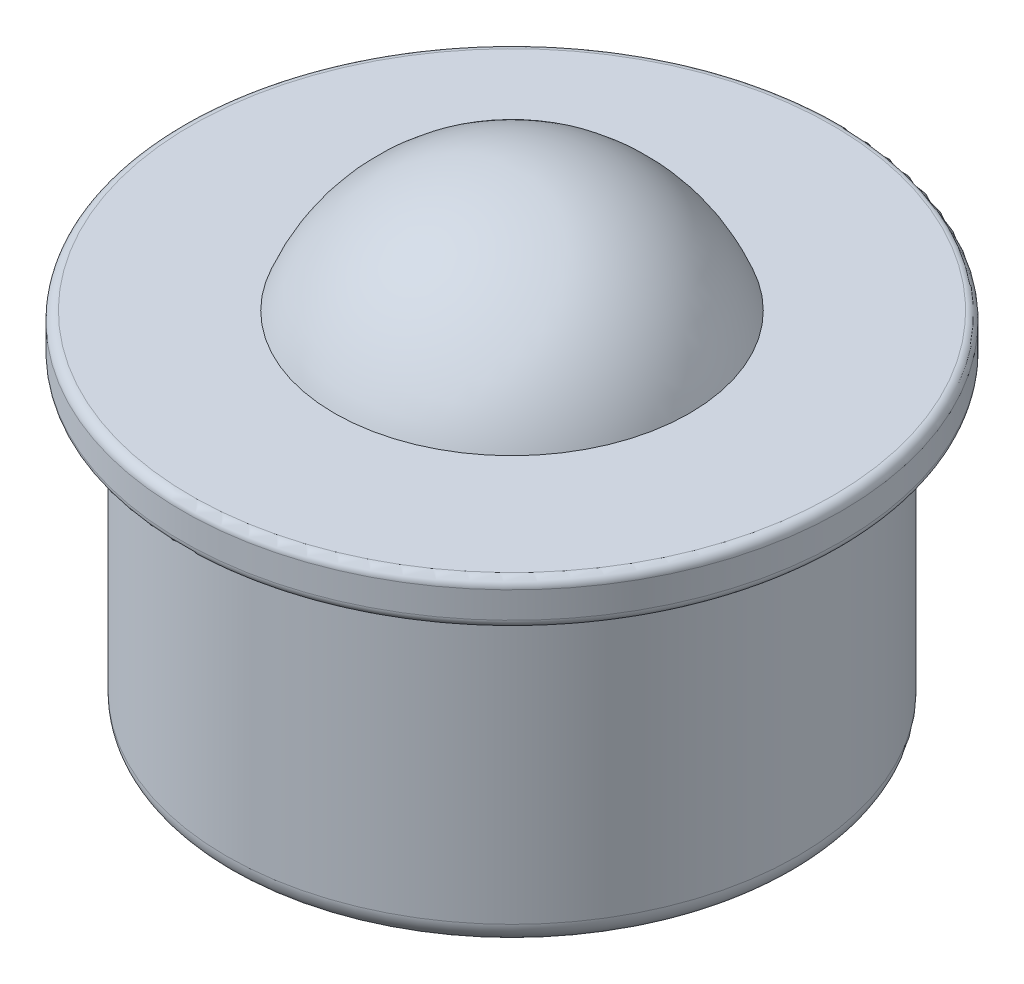
ISO-10303-21;
HEADER;
FILE_DESCRIPTION(('STEP AP214'),'2;1');
FILE_NAME('part.step','',(''),(''),'','','');
FILE_SCHEMA(('AUTOMOTIVE_DESIGN { 1 0 10303 214 1 1 1 1 }'));
ENDSEC;
DATA;
#1=APPLICATION_CONTEXT('core data for automotive mechanical design processes');
#2=APPLICATION_PROTOCOL_DEFINITION('international standard','automotive_design',2000,#1);
#3=PRODUCT_CONTEXT('',#1,'mechanical');
#4=PRODUCT('Part','Part','',(#3));
#5=PRODUCT_RELATED_PRODUCT_CATEGORY('part','',(#4));
#6=PRODUCT_DEFINITION_FORMATION('','',#4);
#7=PRODUCT_DEFINITION_CONTEXT('part definition',#1,'design');
#8=PRODUCT_DEFINITION('design','',#6,#7);
#9=PRODUCT_DEFINITION_SHAPE('','',#8);
#10=(LENGTH_UNIT() NAMED_UNIT(*) SI_UNIT(.MILLI.,.METRE.));
#11=(NAMED_UNIT(*) PLANE_ANGLE_UNIT() SI_UNIT($,.RADIAN.));
#12=(NAMED_UNIT(*) SI_UNIT($,.STERADIAN.) SOLID_ANGLE_UNIT());
#13=UNCERTAINTY_MEASURE_WITH_UNIT(LENGTH_MEASURE(1.E-05),#10,'distance_accuracy_value','');
#14=(GEOMETRIC_REPRESENTATION_CONTEXT(3) GLOBAL_UNCERTAINTY_ASSIGNED_CONTEXT((#13)) GLOBAL_UNIT_ASSIGNED_CONTEXT((#10,
#11,#12)) REPRESENTATION_CONTEXT('',''));
#15=CARTESIAN_POINT('',(0.,0.,0.));
#16=DIRECTION('',(0.,0.,1.));
#17=DIRECTION('',(1.,0.,0.));
#18=AXIS2_PLACEMENT_3D('',#15,#16,#17);
#19=CARTESIAN_POINT('',(0.,0.,0.));
#20=DIRECTION('',(0.,1.,0.));
#21=DIRECTION('',(-1.,0.,0.));
#22=AXIS2_PLACEMENT_3D('',#19,#20,#21);
#23=PLANE('',#22);
#24=CARTESIAN_POINT('',(0.,0.,0.));
#25=DIRECTION('',(0.,1.,0.));
#26=DIRECTION('',(-1.,0.,0.));
#27=AXIS2_PLACEMENT_3D('',#24,#25,#26);
#28=CIRCLE('',#27,6.);
#29=CARTESIAN_POINT('',(-6.,0.,0.));
#30=VERTEX_POINT('',#29);
#31=EDGE_CURVE('E53',#30,#30,#28,.F.);
#32=ORIENTED_EDGE('',*,*,#31,.T.);
#33=EDGE_LOOP('',(#32));
#34=FACE_BOUND('',#33,.T.);
#35=ADVANCED_FACE('F33',(#34),#23,.F.);
#36=CARTESIAN_POINT('',(0.,28.4040034859657,0.));
#37=DIRECTION('',(0.,1.,0.));
#38=DIRECTION('',(-1.,0.,0.));
#39=AXIS2_PLACEMENT_3D('',#36,#37,#38);
#40=CYLINDRICAL_SURFACE('',#39,6.5);
#41=CARTESIAN_POINT('',(0.,0.5,0.));
#42=DIRECTION('',(0.,1.,0.));
#43=DIRECTION('',(-1.,0.,0.));
#44=AXIS2_PLACEMENT_3D('',#41,#42,#43);
#45=CIRCLE('',#44,6.5);
#46=CARTESIAN_POINT('',(-6.5,0.5,0.));
#47=VERTEX_POINT('',#46);
#48=EDGE_CURVE('E56',#47,#47,#45,.T.);
#49=ORIENTED_EDGE('',*,*,#48,.T.);
#50=EDGE_LOOP('',(#49));
#51=FACE_BOUND('',#50,.T.);
#52=CARTESIAN_POINT('',(0.,7.,0.));
#53=DIRECTION('',(0.,1.,0.));
#54=DIRECTION('',(-1.,0.,0.));
#55=AXIS2_PLACEMENT_3D('',#52,#53,#54);
#56=CIRCLE('',#55,6.5);
#57=CARTESIAN_POINT('',(-6.5,7.,0.));
#58=VERTEX_POINT('',#57);
#59=EDGE_CURVE('E59',#58,#58,#56,.T.);
#60=ORIENTED_EDGE('',*,*,#59,.F.);
#61=EDGE_LOOP('',(#60));
#62=FACE_BOUND('',#61,.T.);
#63=ADVANCED_FACE('F82',(#51,#62),#40,.T.);
#64=CARTESIAN_POINT('',(6.5,7.,0.));
#65=DIRECTION('',(0.,1.,0.));
#66=DIRECTION('',(-1.,0.,0.));
#67=AXIS2_PLACEMENT_3D('',#64,#65,#66);
#68=PLANE('',#67);
#69=CARTESIAN_POINT('',(0.,7.,0.));
#70=DIRECTION('',(0.,1.,0.));
#71=DIRECTION('',(-1.,0.,0.));
#72=AXIS2_PLACEMENT_3D('',#69,#70,#71);
#73=CIRCLE('',#72,7.3);
#74=CARTESIAN_POINT('',(-7.3,7.,0.));
#75=VERTEX_POINT('',#74);
#76=EDGE_CURVE('E40',#75,#75,#73,.F.);
#77=ORIENTED_EDGE('',*,*,#76,.T.);
#78=EDGE_LOOP('',(#77));
#79=FACE_BOUND('',#78,.T.);
#80=ORIENTED_EDGE('',*,*,#59,.T.);
#81=EDGE_LOOP('',(#80));
#82=FACE_BOUND('',#81,.T.);
#83=ADVANCED_FACE('F78',(#79,#82),#68,.F.);
#84=CARTESIAN_POINT('',(0.,28.4040034859657,0.));
#85=DIRECTION('',(0.,1.,0.));
#86=DIRECTION('',(-1.,0.,0.));
#87=AXIS2_PLACEMENT_3D('',#84,#85,#86);
#88=CYLINDRICAL_SURFACE('',#87,7.5);
#89=CARTESIAN_POINT('',(0.,7.2,0.));
#90=DIRECTION('',(0.,1.,0.));
#91=DIRECTION('',(-1.,0.,0.));
#92=AXIS2_PLACEMENT_3D('',#89,#90,#91);
#93=CIRCLE('',#92,7.5);
#94=CARTESIAN_POINT('',(-7.5,7.2,0.));
#95=VERTEX_POINT('',#94);
#96=EDGE_CURVE('E44',#95,#95,#93,.T.);
#97=ORIENTED_EDGE('',*,*,#96,.T.);
#98=EDGE_LOOP('',(#97));
#99=FACE_BOUND('',#98,.T.);
#100=CARTESIAN_POINT('',(0.,7.8,0.));
#101=DIRECTION('',(0.,-1.,0.));
#102=DIRECTION('',(1.,0.,0.));
#103=AXIS2_PLACEMENT_3D('',#100,#101,#102);
#104=CIRCLE('',#103,7.5);
#105=CARTESIAN_POINT('',(7.50000000000001,7.8,0.));
#106=VERTEX_POINT('',#105);
#107=EDGE_CURVE('E48',#106,#106,#104,.T.);
#108=ORIENTED_EDGE('',*,*,#107,.T.);
#109=EDGE_LOOP('',(#108));
#110=FACE_BOUND('',#109,.T.);
#111=ADVANCED_FACE('F70',(#99,#110),#88,.T.);
#112=CARTESIAN_POINT('',(4.04376062595204,8.,0.));
#113=DIRECTION('',(0.,-1.,0.));
#114=DIRECTION('',(1.,0.,0.));
#115=AXIS2_PLACEMENT_3D('',#112,#113,#114);
#116=PLANE('',#115);
#117=CARTESIAN_POINT('',(0.,8.,0.));
#118=DIRECTION('',(0.,-1.,0.));
#119=DIRECTION('',(1.,0.,0.));
#120=AXIS2_PLACEMENT_3D('',#117,#118,#119);
#121=CIRCLE('',#120,7.3);
#122=CARTESIAN_POINT('',(7.30000000000001,8.,0.));
#123=VERTEX_POINT('',#122);
#124=EDGE_CURVE('E10',#123,#123,#121,.F.);
#125=ORIENTED_EDGE('',*,*,#124,.T.);
#126=EDGE_LOOP('',(#125));
#127=FACE_BOUND('',#126,.T.);
#128=CARTESIAN_POINT('',(0.,8.,0.));
#129=DIRECTION('',(0.,1.,0.));
#130=DIRECTION('',(-1.,0.,0.));
#131=AXIS2_PLACEMENT_3D('',#128,#129,#130);
#132=CIRCLE('',#131,4.04376062595204);
#133=CARTESIAN_POINT('',(-4.04376062595203,8.,0.));
#134=VERTEX_POINT('',#133);
#135=EDGE_CURVE('E62',#134,#134,#132,.T.);
#136=ORIENTED_EDGE('',*,*,#135,.F.);
#137=EDGE_LOOP('',(#136));
#138=FACE_BOUND('',#137,.T.);
#139=ADVANCED_FACE('F68',(#127,#138),#116,.F.);
#140=CARTESIAN_POINT('',(0.,6.48,0.));
#141=DIRECTION('',(0.,1.,0.));
#142=DIRECTION('',(1.,0.,0.));
#143=AXIS2_PLACEMENT_3D('',#140,#141,#142);
#144=SPHERICAL_SURFACE('',#143,4.32);
#145=ORIENTED_EDGE('',*,*,#135,.T.);
#146=EDGE_LOOP('',(#145));
#147=FACE_BOUND('',#146,.T.);
#148=ADVANCED_FACE('F66',(#147),#144,.T.);
#149=CARTESIAN_POINT('',(0.,0.5,0.));
#150=DIRECTION('',(0.,1.,0.));
#151=DIRECTION('',(-1.,0.,0.));
#152=AXIS2_PLACEMENT_3D('',#149,#150,#151);
#153=TOROIDAL_SURFACE('',#152,6.,0.5);
#154=ORIENTED_EDGE('',*,*,#31,.F.);
#155=EDGE_LOOP('',(#154));
#156=FACE_BOUND('',#155,.T.);
#157=ORIENTED_EDGE('',*,*,#48,.F.);
#158=EDGE_LOOP('',(#157));
#159=FACE_BOUND('',#158,.T.);
#160=ADVANCED_FACE('F76',(#156,#159),#153,.T.);
#161=CARTESIAN_POINT('',(0.,7.2,0.));
#162=DIRECTION('',(0.,1.,0.));
#163=DIRECTION('',(-1.,0.,0.));
#164=AXIS2_PLACEMENT_3D('',#161,#162,#163);
#165=TOROIDAL_SURFACE('',#164,7.3,0.2);
#166=ORIENTED_EDGE('',*,*,#76,.F.);
#167=EDGE_LOOP('',(#166));
#168=FACE_BOUND('',#167,.T.);
#169=ORIENTED_EDGE('',*,*,#96,.F.);
#170=EDGE_LOOP('',(#169));
#171=FACE_BOUND('',#170,.T.);
#172=ADVANCED_FACE('F93',(#168,#171),#165,.T.);
#173=CARTESIAN_POINT('',(0.,7.8,0.));
#174=DIRECTION('',(0.,-1.,0.));
#175=DIRECTION('',(1.,0.,0.));
#176=AXIS2_PLACEMENT_3D('',#173,#174,#175);
#177=TOROIDAL_SURFACE('',#176,7.3,0.2);
#178=ORIENTED_EDGE('',*,*,#107,.F.);
#179=EDGE_LOOP('',(#178));
#180=FACE_BOUND('',#179,.T.);
#181=ORIENTED_EDGE('',*,*,#124,.F.);
#182=EDGE_LOOP('',(#181));
#183=FACE_BOUND('',#182,.T.);
#184=ADVANCED_FACE('F35',(#180,#183),#177,.T.);
#185=CLOSED_SHELL('',(#35,#63,#83,#111,#139,#148,#160,#172,#184));
#186=MANIFOLD_SOLID_BREP('B2',#185);
#187=ADVANCED_BREP_SHAPE_REPRESENTATION('',(#18,#186),#14);
#188=SHAPE_DEFINITION_REPRESENTATION(#9,#187);
ENDSEC;
END-ISO-10303-21;
